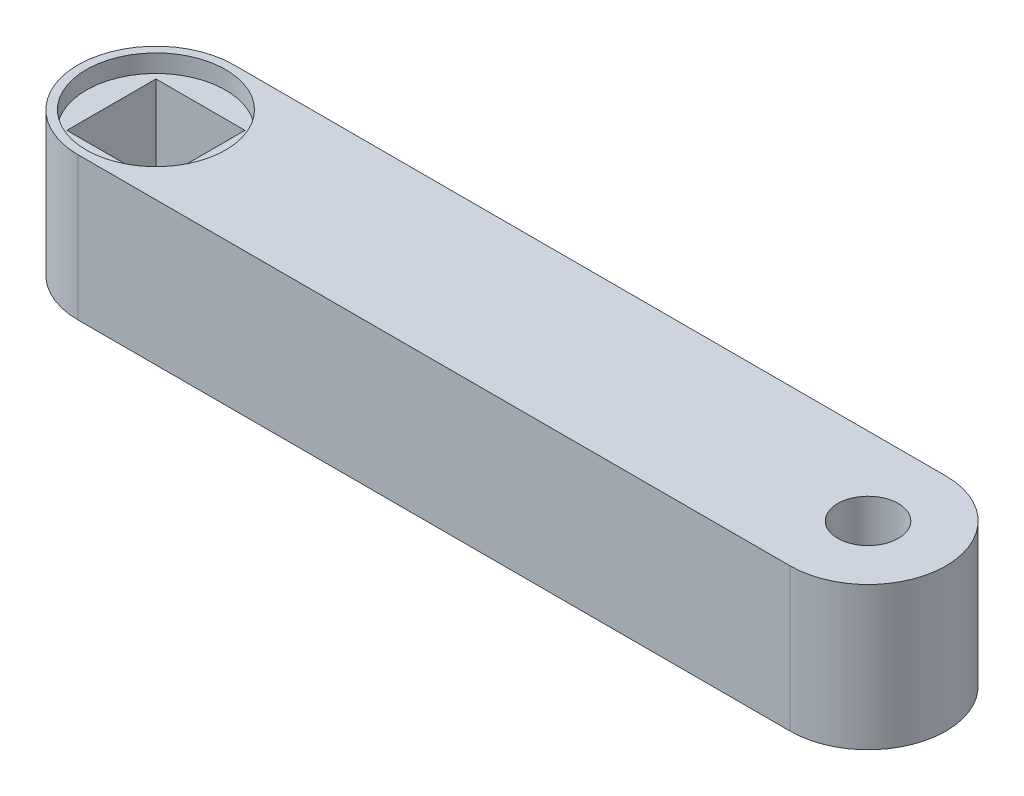
ISO-10303-21;
HEADER;
FILE_DESCRIPTION(('STEP AP214'),'2;1');
FILE_NAME('part.step','',(''),(''),'','','');
FILE_SCHEMA(('AUTOMOTIVE_DESIGN { 1 0 10303 214 1 1 1 1 }'));
ENDSEC;
DATA;
#1=APPLICATION_CONTEXT('core data for automotive mechanical design processes');
#2=APPLICATION_PROTOCOL_DEFINITION('international standard','automotive_design',2000,#1);
#3=PRODUCT_CONTEXT('',#1,'mechanical');
#4=PRODUCT('Part','Part','',(#3));
#5=PRODUCT_RELATED_PRODUCT_CATEGORY('part','',(#4));
#6=PRODUCT_DEFINITION_FORMATION('','',#4);
#7=PRODUCT_DEFINITION_CONTEXT('part definition',#1,'design');
#8=PRODUCT_DEFINITION('design','',#6,#7);
#9=PRODUCT_DEFINITION_SHAPE('','',#8);
#10=(LENGTH_UNIT() NAMED_UNIT(*) SI_UNIT(.MILLI.,.METRE.));
#11=(NAMED_UNIT(*) PLANE_ANGLE_UNIT() SI_UNIT($,.RADIAN.));
#12=(NAMED_UNIT(*) SI_UNIT($,.STERADIAN.) SOLID_ANGLE_UNIT());
#13=UNCERTAINTY_MEASURE_WITH_UNIT(LENGTH_MEASURE(1.E-05),#10,'distance_accuracy_value','');
#14=(GEOMETRIC_REPRESENTATION_CONTEXT(3) GLOBAL_UNCERTAINTY_ASSIGNED_CONTEXT((#13)) GLOBAL_UNIT_ASSIGNED_CONTEXT((#10,
#11,#12)) REPRESENTATION_CONTEXT('',''));
#15=CARTESIAN_POINT('',(0.,0.,0.));
#16=DIRECTION('',(0.,0.,1.));
#17=DIRECTION('',(1.,0.,0.));
#18=AXIS2_PLACEMENT_3D('',#15,#16,#17);
#19=CARTESIAN_POINT('',(3.175,0.,-3.175));
#20=DIRECTION('',(1.,0.,0.));
#21=DIRECTION('',(0.,0.,-1.));
#22=AXIS2_PLACEMENT_3D('',#19,#20,#21);
#23=PLANE('',#22);
#24=DIRECTION('',(0.,0.,-1.));
#25=VECTOR('',#24,1.);
#26=CARTESIAN_POINT('',(3.175,1.27,-3.175));
#27=LINE('',#26,#25);
#28=CARTESIAN_POINT('',(3.175,1.27,3.175));
#29=VERTEX_POINT('',#28);
#30=CARTESIAN_POINT('',(3.175,1.27,-3.175));
#31=VERTEX_POINT('',#30);
#32=EDGE_CURVE('E60',#29,#31,#27,.T.);
#33=ORIENTED_EDGE('',*,*,#32,.F.);
#34=DIRECTION('',(0.,1.,0.));
#35=VECTOR('',#34,1.);
#36=CARTESIAN_POINT('',(3.175,0.,3.175));
#37=LINE('',#36,#35);
#38=CARTESIAN_POINT('',(3.175,8.9408,3.175));
#39=VERTEX_POINT('',#38);
#40=EDGE_CURVE('E129',#29,#39,#37,.T.);
#41=ORIENTED_EDGE('',*,*,#40,.T.);
#42=DIRECTION('',(0.,0.,1.));
#43=VECTOR('',#42,1.);
#44=CARTESIAN_POINT('',(3.175,8.9408,-3.175));
#45=LINE('',#44,#43);
#46=CARTESIAN_POINT('',(3.175,8.9408,-3.175));
#47=VERTEX_POINT('',#46);
#48=EDGE_CURVE('E142',#47,#39,#45,.T.);
#49=ORIENTED_EDGE('',*,*,#48,.F.);
#50=DIRECTION('',(0.,1.,0.));
#51=VECTOR('',#50,1.);
#52=CARTESIAN_POINT('',(3.175,0.,-3.175));
#53=LINE('',#52,#51);
#54=EDGE_CURVE('E125',#31,#47,#53,.T.);
#55=ORIENTED_EDGE('',*,*,#54,.F.);
#56=EDGE_LOOP('',(#33,#41,#49,#55));
#57=FACE_BOUND('',#56,.T.);
#58=ADVANCED_FACE('F45',(#57),#23,.F.);
#59=CARTESIAN_POINT('',(-3.175,0.,3.175));
#60=DIRECTION('',(0.,0.,1.));
#61=DIRECTION('',(1.,0.,0.));
#62=AXIS2_PLACEMENT_3D('',#59,#60,#61);
#63=PLANE('',#62);
#64=DIRECTION('',(1.,0.,0.));
#65=VECTOR('',#64,1.);
#66=CARTESIAN_POINT('',(-3.175,1.27,3.175));
#67=LINE('',#66,#65);
#68=CARTESIAN_POINT('',(-3.175,1.27,3.175));
#69=VERTEX_POINT('',#68);
#70=EDGE_CURVE('E118',#69,#29,#67,.T.);
#71=ORIENTED_EDGE('',*,*,#70,.F.);
#72=DIRECTION('',(0.,1.,0.));
#73=VECTOR('',#72,1.);
#74=CARTESIAN_POINT('',(-3.175,0.,3.175));
#75=LINE('',#74,#73);
#76=CARTESIAN_POINT('',(-3.175,8.9408,3.175));
#77=VERTEX_POINT('',#76);
#78=EDGE_CURVE('E116',#69,#77,#75,.T.);
#79=ORIENTED_EDGE('',*,*,#78,.T.);
#80=DIRECTION('',(-1.,0.,0.));
#81=VECTOR('',#80,1.);
#82=CARTESIAN_POINT('',(-3.175,8.9408,3.175));
#83=LINE('',#82,#81);
#84=EDGE_CURVE('E195',#39,#77,#83,.T.);
#85=ORIENTED_EDGE('',*,*,#84,.F.);
#86=ORIENTED_EDGE('',*,*,#40,.F.);
#87=EDGE_LOOP('',(#71,#79,#85,#86));
#88=FACE_BOUND('',#87,.T.);
#89=ADVANCED_FACE('F238',(#88),#63,.F.);
#90=CARTESIAN_POINT('',(-3.175,0.,-3.175));
#91=DIRECTION('',(-1.,0.,0.));
#92=DIRECTION('',(0.,0.,1.));
#93=AXIS2_PLACEMENT_3D('',#90,#91,#92);
#94=PLANE('',#93);
#95=DIRECTION('',(0.,0.,1.));
#96=VECTOR('',#95,1.);
#97=CARTESIAN_POINT('',(-3.175,1.27,-3.175));
#98=LINE('',#97,#96);
#99=CARTESIAN_POINT('',(-3.175,1.27,-3.175));
#100=VERTEX_POINT('',#99);
#101=EDGE_CURVE('E110',#100,#69,#98,.T.);
#102=ORIENTED_EDGE('',*,*,#101,.F.);
#103=DIRECTION('',(0.,1.,0.));
#104=VECTOR('',#103,1.);
#105=CARTESIAN_POINT('',(-3.175,0.,-3.175));
#106=LINE('',#105,#104);
#107=CARTESIAN_POINT('',(-3.175,8.9408,-3.175));
#108=VERTEX_POINT('',#107);
#109=EDGE_CURVE('E68',#100,#108,#106,.T.);
#110=ORIENTED_EDGE('',*,*,#109,.T.);
#111=DIRECTION('',(0.,0.,-1.));
#112=VECTOR('',#111,1.);
#113=CARTESIAN_POINT('',(-3.175,8.9408,-3.175));
#114=LINE('',#113,#112);
#115=EDGE_CURVE('E191',#77,#108,#114,.T.);
#116=ORIENTED_EDGE('',*,*,#115,.F.);
#117=ORIENTED_EDGE('',*,*,#78,.F.);
#118=EDGE_LOOP('',(#102,#110,#116,#117));
#119=FACE_BOUND('',#118,.T.);
#120=ADVANCED_FACE('F115',(#119),#94,.F.);
#121=CARTESIAN_POINT('',(-3.175,0.,-3.175));
#122=DIRECTION('',(0.,0.,-1.));
#123=DIRECTION('',(-1.,0.,0.));
#124=AXIS2_PLACEMENT_3D('',#121,#122,#123);
#125=PLANE('',#124);
#126=DIRECTION('',(-1.,0.,0.));
#127=VECTOR('',#126,1.);
#128=CARTESIAN_POINT('',(-3.175,1.27,-3.175));
#129=LINE('',#128,#127);
#130=EDGE_CURVE('E11',#31,#100,#129,.T.);
#131=ORIENTED_EDGE('',*,*,#130,.F.);
#132=ORIENTED_EDGE('',*,*,#54,.T.);
#133=DIRECTION('',(1.,0.,0.));
#134=VECTOR('',#133,1.);
#135=CARTESIAN_POINT('',(-3.175,8.9408,-3.175));
#136=LINE('',#135,#134);
#137=EDGE_CURVE('E54',#108,#47,#136,.T.);
#138=ORIENTED_EDGE('',*,*,#137,.F.);
#139=ORIENTED_EDGE('',*,*,#109,.F.);
#140=EDGE_LOOP('',(#131,#132,#138,#139));
#141=FACE_BOUND('',#140,.T.);
#142=ADVANCED_FACE('F122',(#141),#125,.F.);
#143=CARTESIAN_POINT('',(0.,10.2108,0.));
#144=DIRECTION('',(0.,-1.,0.));
#145=DIRECTION('',(0.,0.,-1.));
#146=AXIS2_PLACEMENT_3D('',#143,#144,#145);
#147=CYLINDRICAL_SURFACE('',#146,5.55625);
#148=CARTESIAN_POINT('',(0.,0.,0.));
#149=DIRECTION('',(0.,1.,0.));
#150=DIRECTION('',(0.,0.,1.));
#151=AXIS2_PLACEMENT_3D('',#148,#149,#150);
#152=CIRCLE('',#151,5.55625);
#153=CARTESIAN_POINT('',(0.,0.,-5.55625));
#154=VERTEX_POINT('',#153);
#155=CARTESIAN_POINT('',(0.,0.,5.55625));
#156=VERTEX_POINT('',#155);
#157=EDGE_CURVE('E158',#154,#156,#152,.T.);
#158=ORIENTED_EDGE('',*,*,#157,.T.);
#159=DIRECTION('',(0.,-1.,0.));
#160=VECTOR('',#159,1.);
#161=CARTESIAN_POINT('',(0.,10.2108,5.55625));
#162=LINE('',#161,#160);
#163=CARTESIAN_POINT('',(0.,10.2108,5.55625));
#164=VERTEX_POINT('',#163);
#165=EDGE_CURVE('E181',#164,#156,#162,.T.);
#166=ORIENTED_EDGE('',*,*,#165,.F.);
#167=CARTESIAN_POINT('',(0.,10.2108,0.));
#168=DIRECTION('',(0.,1.,0.));
#169=DIRECTION('',(0.,0.,1.));
#170=AXIS2_PLACEMENT_3D('',#167,#168,#169);
#171=CIRCLE('',#170,5.55625);
#172=CARTESIAN_POINT('',(0.,10.2108,-5.55625));
#173=VERTEX_POINT('',#172);
#174=EDGE_CURVE('E143',#173,#164,#171,.T.);
#175=ORIENTED_EDGE('',*,*,#174,.F.);
#176=DIRECTION('',(0.,-1.,0.));
#177=VECTOR('',#176,1.);
#178=CARTESIAN_POINT('',(0.,10.2108,-5.55625));
#179=LINE('',#178,#177);
#180=EDGE_CURVE('E157',#173,#154,#179,.T.);
#181=ORIENTED_EDGE('',*,*,#180,.T.);
#182=EDGE_LOOP('',(#158,#166,#175,#181));
#183=FACE_BOUND('',#182,.T.);
#184=ADVANCED_FACE('F47',(#183),#147,.T.);
#185=CARTESIAN_POINT('',(0.,10.2108,5.55625));
#186=DIRECTION('',(0.,0.,-1.));
#187=DIRECTION('',(-1.,0.,0.));
#188=AXIS2_PLACEMENT_3D('',#185,#186,#187);
#189=PLANE('',#188);
#190=DIRECTION('',(1.,0.,0.));
#191=VECTOR('',#190,1.);
#192=CARTESIAN_POINT('',(0.,0.,5.55625));
#193=LINE('',#192,#191);
#194=CARTESIAN_POINT('',(50.8,0.,5.55625));
#195=VERTEX_POINT('',#194);
#196=EDGE_CURVE('E162',#156,#195,#193,.T.);
#197=ORIENTED_EDGE('',*,*,#196,.T.);
#198=DIRECTION('',(0.,-1.,0.));
#199=VECTOR('',#198,1.);
#200=CARTESIAN_POINT('',(50.8,10.2108,5.55625));
#201=LINE('',#200,#199);
#202=CARTESIAN_POINT('',(50.8,10.2108,5.55625));
#203=VERTEX_POINT('',#202);
#204=EDGE_CURVE('E177',#203,#195,#201,.T.);
#205=ORIENTED_EDGE('',*,*,#204,.F.);
#206=DIRECTION('',(1.,0.,0.));
#207=VECTOR('',#206,1.);
#208=CARTESIAN_POINT('',(0.,10.2108,5.55625));
#209=LINE('',#208,#207);
#210=EDGE_CURVE('E147',#164,#203,#209,.T.);
#211=ORIENTED_EDGE('',*,*,#210,.F.);
#212=ORIENTED_EDGE('',*,*,#165,.T.);
#213=EDGE_LOOP('',(#197,#205,#211,#212));
#214=FACE_BOUND('',#213,.T.);
#215=ADVANCED_FACE('F265',(#214),#189,.F.);
#216=CARTESIAN_POINT('',(50.8,10.2108,0.));
#217=DIRECTION('',(0.,-1.,0.));
#218=DIRECTION('',(0.,0.,-1.));
#219=AXIS2_PLACEMENT_3D('',#216,#217,#218);
#220=CYLINDRICAL_SURFACE('',#219,5.55625);
#221=CARTESIAN_POINT('',(50.8,0.,0.));
#222=DIRECTION('',(0.,1.,0.));
#223=DIRECTION('',(0.,0.,1.));
#224=AXIS2_PLACEMENT_3D('',#221,#222,#223);
#225=CIRCLE('',#224,5.55625);
#226=CARTESIAN_POINT('',(50.8,0.,-5.55625));
#227=VERTEX_POINT('',#226);
#228=EDGE_CURVE('E165',#195,#227,#225,.T.);
#229=ORIENTED_EDGE('',*,*,#228,.T.);
#230=DIRECTION('',(0.,-1.,0.));
#231=VECTOR('',#230,1.);
#232=CARTESIAN_POINT('',(50.8,10.2108,-5.55625));
#233=LINE('',#232,#231);
#234=CARTESIAN_POINT('',(50.8,10.2108,-5.55625));
#235=VERTEX_POINT('',#234);
#236=EDGE_CURVE('E173',#235,#227,#233,.T.);
#237=ORIENTED_EDGE('',*,*,#236,.F.);
#238=CARTESIAN_POINT('',(50.8,10.2108,0.));
#239=DIRECTION('',(0.,1.,0.));
#240=DIRECTION('',(0.,0.,1.));
#241=AXIS2_PLACEMENT_3D('',#238,#239,#240);
#242=CIRCLE('',#241,5.55625);
#243=EDGE_CURVE('E151',#203,#235,#242,.T.);
#244=ORIENTED_EDGE('',*,*,#243,.F.);
#245=ORIENTED_EDGE('',*,*,#204,.T.);
#246=EDGE_LOOP('',(#229,#237,#244,#245));
#247=FACE_BOUND('',#246,.T.);
#248=ADVANCED_FACE('F262',(#247),#220,.T.);
#249=CARTESIAN_POINT('',(0.,10.2108,-5.55625));
#250=DIRECTION('',(0.,0.,1.));
#251=DIRECTION('',(1.,0.,0.));
#252=AXIS2_PLACEMENT_3D('',#249,#250,#251);
#253=PLANE('',#252);
#254=DIRECTION('',(-1.,0.,0.));
#255=VECTOR('',#254,1.);
#256=CARTESIAN_POINT('',(0.,0.,-5.55625));
#257=LINE('',#256,#255);
#258=EDGE_CURVE('E148',#227,#154,#257,.T.);
#259=ORIENTED_EDGE('',*,*,#258,.T.);
#260=ORIENTED_EDGE('',*,*,#180,.F.);
#261=DIRECTION('',(-1.,0.,0.));
#262=VECTOR('',#261,1.);
#263=CARTESIAN_POINT('',(0.,10.2108,-5.55625));
#264=LINE('',#263,#262);
#265=EDGE_CURVE('E154',#235,#173,#264,.T.);
#266=ORIENTED_EDGE('',*,*,#265,.F.);
#267=ORIENTED_EDGE('',*,*,#236,.T.);
#268=EDGE_LOOP('',(#259,#260,#266,#267));
#269=FACE_BOUND('',#268,.T.);
#270=ADVANCED_FACE('F256',(#269),#253,.F.);
#271=CARTESIAN_POINT('',(0.,10.2108,0.));
#272=DIRECTION('',(0.,1.,0.));
#273=DIRECTION('',(0.,0.,1.));
#274=AXIS2_PLACEMENT_3D('',#271,#272,#273);
#275=PLANE('',#274);
#276=CARTESIAN_POINT('',(0.,10.2108,0.));
#277=DIRECTION('',(0.,1.,0.));
#278=DIRECTION('',(0.,0.,1.));
#279=AXIS2_PLACEMENT_3D('',#276,#277,#278);
#280=CIRCLE('',#279,4.97205);
#281=CARTESIAN_POINT('',(0.,10.2108,4.97205));
#282=VERTEX_POINT('',#281);
#283=EDGE_CURVE('E204',#282,#282,#280,.T.);
#284=ORIENTED_EDGE('',*,*,#283,.F.);
#285=EDGE_LOOP('',(#284));
#286=FACE_BOUND('',#285,.T.);
#287=CARTESIAN_POINT('',(50.8,10.2108,0.));
#288=DIRECTION('',(0.,1.,0.));
#289=DIRECTION('',(0.,0.,1.));
#290=AXIS2_PLACEMENT_3D('',#287,#288,#289);
#291=CIRCLE('',#290,2.159);
#292=CARTESIAN_POINT('',(50.8,10.2108,2.159));
#293=VERTEX_POINT('',#292);
#294=EDGE_CURVE('E131',#293,#293,#291,.T.);
#295=ORIENTED_EDGE('',*,*,#294,.F.);
#296=EDGE_LOOP('',(#295));
#297=FACE_BOUND('',#296,.T.);
#298=ORIENTED_EDGE('',*,*,#174,.T.);
#299=ORIENTED_EDGE('',*,*,#210,.T.);
#300=ORIENTED_EDGE('',*,*,#243,.T.);
#301=ORIENTED_EDGE('',*,*,#265,.T.);
#302=EDGE_LOOP('',(#298,#299,#300,#301));
#303=FACE_BOUND('',#302,.T.);
#304=ADVANCED_FACE('F253',(#286,#297,#303),#275,.T.);
#305=CARTESIAN_POINT('',(0.,0.,0.));
#306=DIRECTION('',(0.,1.,0.));
#307=DIRECTION('',(0.,0.,1.));
#308=AXIS2_PLACEMENT_3D('',#305,#306,#307);
#309=PLANE('',#308);
#310=CARTESIAN_POINT('',(0.,0.,0.));
#311=DIRECTION('',(0.,1.,0.));
#312=DIRECTION('',(0.,0.,1.));
#313=AXIS2_PLACEMENT_3D('',#310,#311,#312);
#314=CIRCLE('',#313,4.97205);
#315=CARTESIAN_POINT('',(0.,0.,4.97205));
#316=VERTEX_POINT('',#315);
#317=EDGE_CURVE('E215',#316,#316,#314,.T.);
#318=ORIENTED_EDGE('',*,*,#317,.T.);
#319=EDGE_LOOP('',(#318));
#320=FACE_BOUND('',#319,.T.);
#321=CARTESIAN_POINT('',(50.8,0.,0.));
#322=DIRECTION('',(0.,1.,0.));
#323=DIRECTION('',(0.,0.,1.));
#324=AXIS2_PLACEMENT_3D('',#321,#322,#323);
#325=CIRCLE('',#324,2.159);
#326=CARTESIAN_POINT('',(50.8,0.,2.159));
#327=VERTEX_POINT('',#326);
#328=EDGE_CURVE('E138',#327,#327,#325,.T.);
#329=ORIENTED_EDGE('',*,*,#328,.T.);
#330=EDGE_LOOP('',(#329));
#331=FACE_BOUND('',#330,.T.);
#332=ORIENTED_EDGE('',*,*,#157,.F.);
#333=ORIENTED_EDGE('',*,*,#258,.F.);
#334=ORIENTED_EDGE('',*,*,#228,.F.);
#335=ORIENTED_EDGE('',*,*,#196,.F.);
#336=EDGE_LOOP('',(#332,#333,#334,#335));
#337=FACE_BOUND('',#336,.T.);
#338=ADVANCED_FACE('F251',(#320,#331,#337),#309,.F.);
#339=CARTESIAN_POINT('',(50.8,0.,0.));
#340=DIRECTION('',(0.,1.,0.));
#341=DIRECTION('',(0.,0.,1.));
#342=AXIS2_PLACEMENT_3D('',#339,#340,#341);
#343=CYLINDRICAL_SURFACE('',#342,2.159);
#344=ORIENTED_EDGE('',*,*,#328,.F.);
#345=EDGE_LOOP('',(#344));
#346=FACE_BOUND('',#345,.T.);
#347=ORIENTED_EDGE('',*,*,#294,.T.);
#348=EDGE_LOOP('',(#347));
#349=FACE_BOUND('',#348,.T.);
#350=ADVANCED_FACE('F248',(#346,#349),#343,.F.);
#351=CARTESIAN_POINT('',(0.,8.9408,0.));
#352=DIRECTION('',(0.,1.,0.));
#353=DIRECTION('',(0.,0.,1.));
#354=AXIS2_PLACEMENT_3D('',#351,#352,#353);
#355=PLANE('',#354);
#356=CARTESIAN_POINT('',(0.,8.9408,0.));
#357=DIRECTION('',(0.,1.,0.));
#358=DIRECTION('',(0.,0.,1.));
#359=AXIS2_PLACEMENT_3D('',#356,#357,#358);
#360=CIRCLE('',#359,4.97205);
#361=CARTESIAN_POINT('',(0.,8.9408,4.97205));
#362=VERTEX_POINT('',#361);
#363=EDGE_CURVE('E203',#362,#362,#360,.T.);
#364=ORIENTED_EDGE('',*,*,#363,.T.);
#365=EDGE_LOOP('',(#364));
#366=FACE_BOUND('',#365,.T.);
#367=ORIENTED_EDGE('',*,*,#48,.T.);
#368=ORIENTED_EDGE('',*,*,#84,.T.);
#369=ORIENTED_EDGE('',*,*,#115,.T.);
#370=ORIENTED_EDGE('',*,*,#137,.T.);
#371=EDGE_LOOP('',(#367,#368,#369,#370));
#372=FACE_BOUND('',#371,.T.);
#373=ADVANCED_FACE('F188',(#366,#372),#355,.T.);
#374=CARTESIAN_POINT('',(0.,8.9408,0.));
#375=DIRECTION('',(0.,1.,0.));
#376=DIRECTION('',(0.,0.,1.));
#377=AXIS2_PLACEMENT_3D('',#374,#375,#376);
#378=CYLINDRICAL_SURFACE('',#377,4.97205);
#379=ORIENTED_EDGE('',*,*,#363,.F.);
#380=EDGE_LOOP('',(#379));
#381=FACE_BOUND('',#380,.T.);
#382=ORIENTED_EDGE('',*,*,#283,.T.);
#383=EDGE_LOOP('',(#382));
#384=FACE_BOUND('',#383,.T.);
#385=ADVANCED_FACE('F227',(#381,#384),#378,.F.);
#386=CARTESIAN_POINT('',(0.,1.27,0.));
#387=DIRECTION('',(0.,-1.,0.));
#388=DIRECTION('',(0.,0.,1.));
#389=AXIS2_PLACEMENT_3D('',#386,#387,#388);
#390=PLANE('',#389);
#391=CARTESIAN_POINT('',(0.,1.27,0.));
#392=DIRECTION('',(0.,1.,0.));
#393=DIRECTION('',(0.,0.,1.));
#394=AXIS2_PLACEMENT_3D('',#391,#392,#393);
#395=CIRCLE('',#394,4.97205);
#396=CARTESIAN_POINT('',(0.,1.27,4.97205));
#397=VERTEX_POINT('',#396);
#398=EDGE_CURVE('E119',#397,#397,#395,.T.);
#399=ORIENTED_EDGE('',*,*,#398,.F.);
#400=EDGE_LOOP('',(#399));
#401=FACE_BOUND('',#400,.T.);
#402=ORIENTED_EDGE('',*,*,#32,.T.);
#403=ORIENTED_EDGE('',*,*,#130,.T.);
#404=ORIENTED_EDGE('',*,*,#101,.T.);
#405=ORIENTED_EDGE('',*,*,#70,.T.);
#406=EDGE_LOOP('',(#402,#403,#404,#405));
#407=FACE_BOUND('',#406,.T.);
#408=ADVANCED_FACE('F109',(#401,#407),#390,.T.);
#409=CARTESIAN_POINT('',(0.,1.27,0.));
#410=DIRECTION('',(0.,-1.,0.));
#411=DIRECTION('',(0.,0.,-1.));
#412=AXIS2_PLACEMENT_3D('',#409,#410,#411);
#413=CYLINDRICAL_SURFACE('',#412,4.97205);
#414=ORIENTED_EDGE('',*,*,#398,.T.);
#415=EDGE_LOOP('',(#414));
#416=FACE_BOUND('',#415,.T.);
#417=ORIENTED_EDGE('',*,*,#317,.F.);
#418=EDGE_LOOP('',(#417));
#419=FACE_BOUND('',#418,.T.);
#420=ADVANCED_FACE('F223',(#416,#419),#413,.F.);
#421=CLOSED_SHELL('',(#58,#89,#120,#142,#184,#215,#248,#270,#304,#338,#350,#373,#385,#408,#420));
#422=MANIFOLD_SOLID_BREP('B2',#421);
#423=ADVANCED_BREP_SHAPE_REPRESENTATION('',(#18,#422),#14);
#424=SHAPE_DEFINITION_REPRESENTATION(#9,#423);
ENDSEC;
END-ISO-10303-21;
